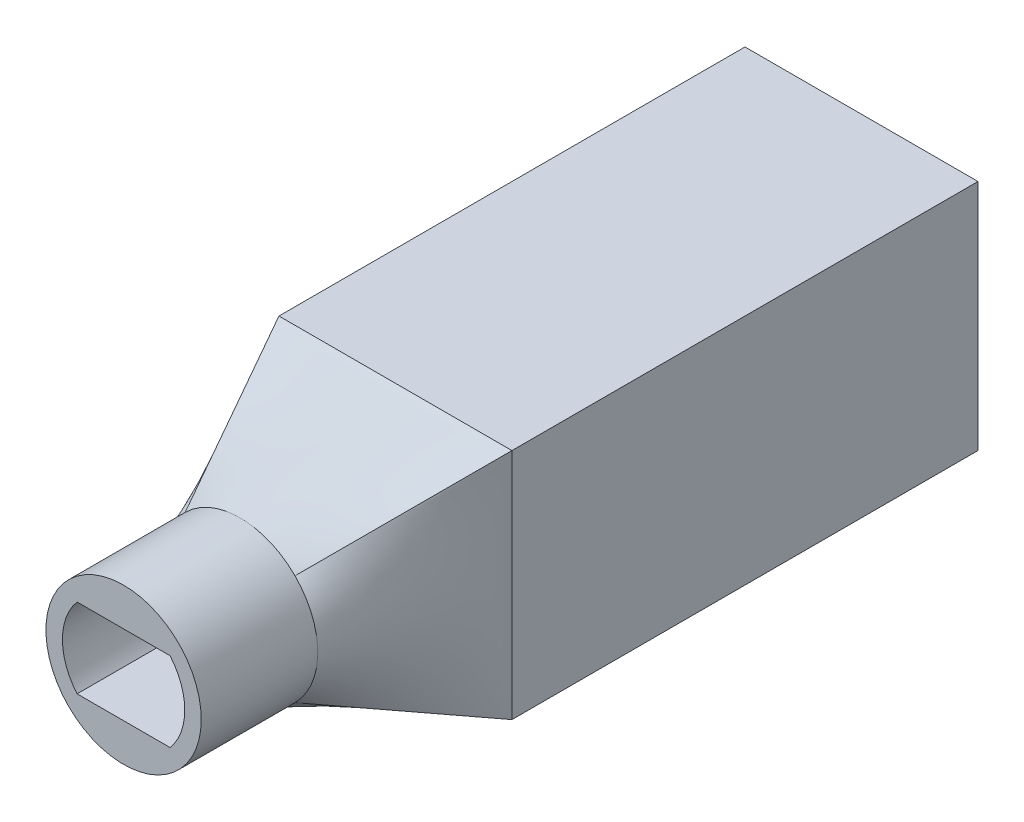
ISO-10303-21;
HEADER;
FILE_DESCRIPTION(('STEP AP214'),'2;1');
FILE_NAME('part.step','',(''),(''),'','','');
FILE_SCHEMA(('AUTOMOTIVE_DESIGN { 1 0 10303 214 1 1 1 1 }'));
ENDSEC;
DATA;
#1=APPLICATION_CONTEXT('core data for automotive mechanical design processes');
#2=APPLICATION_PROTOCOL_DEFINITION('international standard','automotive_design',2000,#1);
#3=PRODUCT_CONTEXT('',#1,'mechanical');
#4=PRODUCT('Part','Part','',(#3));
#5=PRODUCT_RELATED_PRODUCT_CATEGORY('part','',(#4));
#6=PRODUCT_DEFINITION_FORMATION('','',#4);
#7=PRODUCT_DEFINITION_CONTEXT('part definition',#1,'design');
#8=PRODUCT_DEFINITION('design','',#6,#7);
#9=PRODUCT_DEFINITION_SHAPE('','',#8);
#10=(LENGTH_UNIT() NAMED_UNIT(*) SI_UNIT(.MILLI.,.METRE.));
#11=(NAMED_UNIT(*) PLANE_ANGLE_UNIT() SI_UNIT($,.RADIAN.));
#12=(NAMED_UNIT(*) SI_UNIT($,.STERADIAN.) SOLID_ANGLE_UNIT());
#13=UNCERTAINTY_MEASURE_WITH_UNIT(LENGTH_MEASURE(1.E-05),#10,'distance_accuracy_value','');
#14=(GEOMETRIC_REPRESENTATION_CONTEXT(3) GLOBAL_UNCERTAINTY_ASSIGNED_CONTEXT((#13)) GLOBAL_UNIT_ASSIGNED_CONTEXT((#10,
#11,#12)) REPRESENTATION_CONTEXT('',''));
#15=CARTESIAN_POINT('',(0.,0.,0.));
#16=DIRECTION('',(0.,0.,1.));
#17=DIRECTION('',(1.,0.,0.));
#18=AXIS2_PLACEMENT_3D('',#15,#16,#17);
#19=CARTESIAN_POINT('',(0.,0.,38.1));
#20=DIRECTION('',(1.,0.,0.));
#21=DIRECTION('',(0.,0.,-1.));
#22=AXIS2_PLACEMENT_3D('',#19,#20,#21);
#23=PLANE('',#22);
#24=DIRECTION('',(0.,-1.,0.));
#25=VECTOR('',#24,1.);
#26=CARTESIAN_POINT('',(0.,0.,0.));
#27=LINE('',#26,#25);
#28=CARTESIAN_POINT('',(0.,19.05,0.));
#29=VERTEX_POINT('',#28);
#30=CARTESIAN_POINT('',(0.,0.,0.));
#31=VERTEX_POINT('',#30);
#32=EDGE_CURVE('E314',#29,#31,#27,.T.);
#33=ORIENTED_EDGE('',*,*,#32,.T.);
#34=DIRECTION('',(0.,0.,-1.));
#35=VECTOR('',#34,1.);
#36=CARTESIAN_POINT('',(0.,0.,38.1));
#37=LINE('',#36,#35);
#38=CARTESIAN_POINT('',(0.,0.,38.1));
#39=VERTEX_POINT('',#38);
#40=EDGE_CURVE('E12',#39,#31,#37,.T.);
#41=ORIENTED_EDGE('',*,*,#40,.F.);
#42=DIRECTION('',(0.,1.,0.));
#43=VECTOR('',#42,1.);
#44=CARTESIAN_POINT('',(0.,0.,38.1));
#45=LINE('',#44,#43);
#46=CARTESIAN_POINT('',(0.,19.05,38.1));
#47=VERTEX_POINT('',#46);
#48=EDGE_CURVE('E332',#47,#39,#45,.F.);
#49=ORIENTED_EDGE('',*,*,#48,.F.);
#50=DIRECTION('',(0.,0.,-1.));
#51=VECTOR('',#50,1.);
#52=CARTESIAN_POINT('',(0.,19.05,38.1));
#53=LINE('',#52,#51);
#54=EDGE_CURVE('E333',#47,#29,#53,.T.);
#55=ORIENTED_EDGE('',*,*,#54,.T.);
#56=EDGE_LOOP('',(#33,#41,#49,#55));
#57=FACE_BOUND('',#56,.T.);
#58=ADVANCED_FACE('F63',(#57),#23,.F.);
#59=CARTESIAN_POINT('',(0.,0.,38.1));
#60=DIRECTION('',(0.,1.,0.));
#61=DIRECTION('',(0.,0.,1.));
#62=AXIS2_PLACEMENT_3D('',#59,#60,#61);
#63=PLANE('',#62);
#64=DIRECTION('',(1.,0.,0.));
#65=VECTOR('',#64,1.);
#66=CARTESIAN_POINT('',(0.,0.,0.));
#67=LINE('',#66,#65);
#68=CARTESIAN_POINT('',(19.05,0.,0.));
#69=VERTEX_POINT('',#68);
#70=EDGE_CURVE('E320',#31,#69,#67,.T.);
#71=ORIENTED_EDGE('',*,*,#70,.T.);
#72=DIRECTION('',(0.,0.,-1.));
#73=VECTOR('',#72,1.);
#74=CARTESIAN_POINT('',(19.05,0.,38.1));
#75=LINE('',#74,#73);
#76=CARTESIAN_POINT('',(19.05,0.,38.1));
#77=VERTEX_POINT('',#76);
#78=EDGE_CURVE('E72',#77,#69,#75,.T.);
#79=ORIENTED_EDGE('',*,*,#78,.F.);
#80=DIRECTION('',(1.,0.,0.));
#81=VECTOR('',#80,1.);
#82=CARTESIAN_POINT('',(0.,0.,38.1));
#83=LINE('',#82,#81);
#84=EDGE_CURVE('E308',#39,#77,#83,.T.);
#85=ORIENTED_EDGE('',*,*,#84,.F.);
#86=ORIENTED_EDGE('',*,*,#40,.T.);
#87=EDGE_LOOP('',(#71,#79,#85,#86));
#88=FACE_BOUND('',#87,.T.);
#89=ADVANCED_FACE('F347',(#88),#63,.F.);
#90=CARTESIAN_POINT('',(19.05,0.,38.1));
#91=DIRECTION('',(-1.,0.,0.));
#92=DIRECTION('',(0.,0.,1.));
#93=AXIS2_PLACEMENT_3D('',#90,#91,#92);
#94=PLANE('',#93);
#95=DIRECTION('',(0.,1.,0.));
#96=VECTOR('',#95,1.);
#97=CARTESIAN_POINT('',(19.05,0.,0.));
#98=LINE('',#97,#96);
#99=CARTESIAN_POINT('',(19.05,19.05,0.));
#100=VERTEX_POINT('',#99);
#101=EDGE_CURVE('E325',#69,#100,#98,.T.);
#102=ORIENTED_EDGE('',*,*,#101,.T.);
#103=DIRECTION('',(0.,0.,-1.));
#104=VECTOR('',#103,1.);
#105=CARTESIAN_POINT('',(19.05,19.05,38.1));
#106=LINE('',#105,#104);
#107=CARTESIAN_POINT('',(19.05,19.05,38.1));
#108=VERTEX_POINT('',#107);
#109=EDGE_CURVE('E335',#108,#100,#106,.T.);
#110=ORIENTED_EDGE('',*,*,#109,.F.);
#111=DIRECTION('',(0.,1.,0.));
#112=VECTOR('',#111,1.);
#113=CARTESIAN_POINT('',(19.05,0.,38.1));
#114=LINE('',#113,#112);
#115=EDGE_CURVE('E343',#77,#108,#114,.T.);
#116=ORIENTED_EDGE('',*,*,#115,.F.);
#117=ORIENTED_EDGE('',*,*,#78,.T.);
#118=EDGE_LOOP('',(#102,#110,#116,#117));
#119=FACE_BOUND('',#118,.T.);
#120=ADVANCED_FACE('F358',(#119),#94,.F.);
#121=CARTESIAN_POINT('',(0.,19.05,38.1));
#122=DIRECTION('',(0.,-1.,0.));
#123=DIRECTION('',(0.,0.,-1.));
#124=AXIS2_PLACEMENT_3D('',#121,#122,#123);
#125=PLANE('',#124);
#126=DIRECTION('',(-1.,0.,0.));
#127=VECTOR('',#126,1.);
#128=CARTESIAN_POINT('',(0.,19.05,0.));
#129=LINE('',#128,#127);
#130=EDGE_CURVE('E328',#100,#29,#129,.T.);
#131=ORIENTED_EDGE('',*,*,#130,.T.);
#132=ORIENTED_EDGE('',*,*,#54,.F.);
#133=DIRECTION('',(1.,0.,0.));
#134=VECTOR('',#133,1.);
#135=CARTESIAN_POINT('',(0.,19.05,38.1));
#136=LINE('',#135,#134);
#137=EDGE_CURVE('E336',#108,#47,#136,.F.);
#138=ORIENTED_EDGE('',*,*,#137,.F.);
#139=ORIENTED_EDGE('',*,*,#109,.T.);
#140=EDGE_LOOP('',(#131,#132,#138,#139));
#141=FACE_BOUND('',#140,.T.);
#142=ADVANCED_FACE('F353',(#141),#125,.F.);
#143=CARTESIAN_POINT('',(0.,0.,0.));
#144=DIRECTION('',(0.,0.,-1.));
#145=DIRECTION('',(-1.,0.,0.));
#146=AXIS2_PLACEMENT_3D('',#143,#144,#145);
#147=PLANE('',#146);
#148=ORIENTED_EDGE('',*,*,#32,.F.);
#149=ORIENTED_EDGE('',*,*,#130,.F.);
#150=ORIENTED_EDGE('',*,*,#101,.F.);
#151=ORIENTED_EDGE('',*,*,#70,.F.);
#152=EDGE_LOOP('',(#148,#149,#150,#151));
#153=FACE_BOUND('',#152,.T.);
#154=ADVANCED_FACE('F212',(#153),#147,.T.);
#155=CARTESIAN_POINT('',(19.05,19.05,38.1));
#156=CARTESIAN_POINT('',(14.0151280605346,14.0151280605346,50.8));
#157=CARTESIAN_POINT('',(18.25625,19.05,38.1));
#158=CARTESIAN_POINT('',(13.7505447272012,14.2797113938679,50.8));
#159=CARTESIAN_POINT('',(17.4625,19.05,38.1));
#160=CARTESIAN_POINT('',(13.4525460627393,14.5306683581894,50.8));
#161=CARTESIAN_POINT('',(15.875,19.05,38.1));
#162=CARTESIAN_POINT('',(12.7937131756313,14.9837405106463,50.8));
#163=CARTESIAN_POINT('',(15.08125,19.05,38.1));
#164=CARTESIAN_POINT('',(12.4328453080246,15.1857090056158,50.8));
#165=CARTESIAN_POINT('',(13.49375,19.05,38.1));
#166=CARTESIAN_POINT('',(11.6613070052137,15.5196128449747,50.8));
#167=CARTESIAN_POINT('',(12.7,19.05,38.1));
#168=CARTESIAN_POINT('',(11.2506969744019,15.6513845272099,50.8));
#169=CARTESIAN_POINT('',(11.1125,19.05,38.1));
#170=CARTESIAN_POINT('',(10.4016533511812,15.8291332730645,50.8));
#171=CARTESIAN_POINT('',(10.31875,19.05,38.1));
#172=CARTESIAN_POINT('',(9.9633760201782,15.875,50.8));
#173=CARTESIAN_POINT('',(8.73124999999999,19.05,38.1));
#174=CARTESIAN_POINT('',(9.08662397982181,15.875,50.8));
#175=CARTESIAN_POINT('',(7.93749999999999,19.05,38.1));
#176=CARTESIAN_POINT('',(8.64834664881885,15.8291332730645,50.8));
#177=CARTESIAN_POINT('',(6.34999999999999,19.05,38.1));
#178=CARTESIAN_POINT('',(7.79930302559813,15.6513845272099,50.8));
#179=CARTESIAN_POINT('',(5.55624999999999,19.05,38.1));
#180=CARTESIAN_POINT('',(7.38869299478637,15.5196128449747,50.8));
#181=CARTESIAN_POINT('',(3.96874999999999,19.05,38.1));
#182=CARTESIAN_POINT('',(6.61715469197545,15.1857090056158,50.8));
#183=CARTESIAN_POINT('',(3.17499999999999,19.05,38.1));
#184=CARTESIAN_POINT('',(6.25628682436875,14.9837405106463,50.8));
#185=CARTESIAN_POINT('',(1.5875,19.05,38.1));
#186=CARTESIAN_POINT('',(5.59745393726075,14.5306683581894,50.8));
#187=CARTESIAN_POINT('',(0.793749999999998,19.05,38.1));
#188=CARTESIAN_POINT('',(5.29945527279876,14.2797113938679,50.8));
#189=CARTESIAN_POINT('',(0.,19.05,38.1));
#190=CARTESIAN_POINT('',(5.03487193946543,14.0151280605346,50.8));
#191=B_SPLINE_SURFACE_WITH_KNOTS('',3,1,((#155,#156),(#157,#158),(#159,#160),(#161,#162),(#163,
#164),(#165,#166),(#167,#168),(#169,#170),(#171,#172),(#173,#174),(#175,#176),(#177,#178),(#179,
#180),(#181,#182),(#183,#184),(#185,#186),(#187,#188),(#189,#190)),.UNSPECIFIED.,.F.,.F.,.F.,(4,
2,2,2,2,2,2,2,4),(2,2),(0.,0.125,0.25,0.375,0.5,0.625,0.75,0.875,1.),(0.,1.),.UNSPECIFIED.);
#192=DIRECTION('',(0.345804685672962,-0.345804685672962,0.872260419102717));
#193=VECTOR('',#192,1.);
#194=CARTESIAN_POINT('',(2.51743596973271,16.5325640302673,44.45));
#195=LINE('',#194,#193);
#196=CARTESIAN_POINT('',(5.03487193946543,14.0151280605346,50.8));
#197=VERTEX_POINT('',#196);
#198=EDGE_CURVE('E295',#47,#197,#195,.T.);
#199=CARTESIAN_POINT('',(9.525,9.525,50.8));
#200=DIRECTION('',(0.,0.,1.));
#201=DIRECTION('',(1.,0.,0.));
#202=AXIS2_PLACEMENT_3D('',#199,#200,#201);
#203=CIRCLE('',#202,6.35);
#204=CARTESIAN_POINT('',(14.0151280605346,14.0151280605346,50.8));
#205=VERTEX_POINT('',#204);
#206=EDGE_CURVE('E66',#205,#197,#203,.T.);
#207=DIRECTION('',(0.345804685672962,0.345804685672963,-0.872260419102717));
#208=VECTOR('',#207,1.);
#209=CARTESIAN_POINT('',(16.5325640302673,16.5325640302673,44.45));
#210=LINE('',#209,#208);
#211=EDGE_CURVE('E180',#205,#108,#210,.T.);
#212=ORIENTED_EDGE('',*,*,#137,.T.);
#213=ORIENTED_EDGE('',*,*,#198,.T.);
#214=ORIENTED_EDGE('',*,*,#206,.F.);
#215=ORIENTED_EDGE('',*,*,#211,.T.);
#216=EDGE_LOOP('',(#212,#213,#214,#215));
#217=FACE_BOUND('',#216,.T.);
#218=ADVANCED_FACE('F205',(#217),#191,.T.);
#219=CARTESIAN_POINT('',(0.,19.05,38.1));
#220=CARTESIAN_POINT('',(5.03487193946543,14.0151280605346,50.8));
#221=CARTESIAN_POINT('',(0.,18.25625,38.1));
#222=CARTESIAN_POINT('',(4.77028860613209,13.7505447272012,50.8));
#223=CARTESIAN_POINT('',(0.,17.4625,38.1));
#224=CARTESIAN_POINT('',(4.51933164181065,13.4525460627393,50.8));
#225=CARTESIAN_POINT('',(0.,15.875,38.1));
#226=CARTESIAN_POINT('',(4.06625948935367,12.7937131756313,50.8));
#227=CARTESIAN_POINT('',(0.,15.08125,38.1));
#228=CARTESIAN_POINT('',(3.86429099438416,12.4328453080246,50.8));
#229=CARTESIAN_POINT('',(0.,13.49375,38.1));
#230=CARTESIAN_POINT('',(3.53038715502529,11.6613070052136,50.8));
#231=CARTESIAN_POINT('',(0.,12.7,38.1));
#232=CARTESIAN_POINT('',(3.39861547279014,11.2506969744019,50.8));
#233=CARTESIAN_POINT('',(0.,11.1125,38.1));
#234=CARTESIAN_POINT('',(3.22086672693549,10.4016533511811,50.8));
#235=CARTESIAN_POINT('',(0.,10.31875,38.1));
#236=CARTESIAN_POINT('',(3.175,9.96337602017819,50.8));
#237=CARTESIAN_POINT('',(0.,8.73124999999999,38.1));
#238=CARTESIAN_POINT('',(3.175,9.08662397982181,50.8));
#239=CARTESIAN_POINT('',(0.,7.93749999999999,38.1));
#240=CARTESIAN_POINT('',(3.22086672693549,8.64834664881885,50.8));
#241=CARTESIAN_POINT('',(0.,6.34999999999999,38.1));
#242=CARTESIAN_POINT('',(3.39861547279014,7.79930302559812,50.8));
#243=CARTESIAN_POINT('',(0.,5.55624999999999,38.1));
#244=CARTESIAN_POINT('',(3.53038715502529,7.38869299478636,50.8));
#245=CARTESIAN_POINT('',(0.,3.96874999999999,38.1));
#246=CARTESIAN_POINT('',(3.86429099438416,6.61715469197544,50.8));
#247=CARTESIAN_POINT('',(0.,3.17499999999999,38.1));
#248=CARTESIAN_POINT('',(4.06625948935367,6.25628682436875,50.8));
#249=CARTESIAN_POINT('',(0.,1.5875,38.1));
#250=CARTESIAN_POINT('',(4.51933164181065,5.59745393726074,50.8));
#251=CARTESIAN_POINT('',(0.,0.793749999999998,38.1));
#252=CARTESIAN_POINT('',(4.77028860613209,5.29945527279875,50.8));
#253=CARTESIAN_POINT('',(0.,0.,38.1));
#254=CARTESIAN_POINT('',(5.03487193946543,5.03487193946542,50.8));
#255=B_SPLINE_SURFACE_WITH_KNOTS('',3,1,((#219,#220),(#221,#222),(#223,#224),(#225,#226),(#227,
#228),(#229,#230),(#231,#232),(#233,#234),(#235,#236),(#237,#238),(#239,#240),(#241,#242),(#243,
#244),(#245,#246),(#247,#248),(#249,#250),(#251,#252),(#253,#254)),.UNSPECIFIED.,.F.,.F.,.F.,(4,
2,2,2,2,2,2,2,4),(2,2),(0.,0.125,0.25,0.375,0.5,0.625,0.75,0.875,1.),(0.,1.),.UNSPECIFIED.);
#256=DIRECTION('',(0.345804685672962,0.345804685672962,0.872260419102717));
#257=VECTOR('',#256,1.);
#258=CARTESIAN_POINT('',(2.51743596973271,2.51743596973271,44.45));
#259=LINE('',#258,#257);
#260=CARTESIAN_POINT('',(5.03487193946543,5.03487193946542,50.8));
#261=VERTEX_POINT('',#260);
#262=EDGE_CURVE('E291',#39,#261,#259,.T.);
#263=EDGE_CURVE('E304',#197,#261,#203,.T.);
#264=ORIENTED_EDGE('',*,*,#48,.T.);
#265=ORIENTED_EDGE('',*,*,#262,.T.);
#266=ORIENTED_EDGE('',*,*,#263,.F.);
#267=ORIENTED_EDGE('',*,*,#198,.F.);
#268=EDGE_LOOP('',(#264,#265,#266,#267));
#269=FACE_BOUND('',#268,.T.);
#270=ADVANCED_FACE('F211',(#269),#255,.T.);
#271=CARTESIAN_POINT('',(19.05,0.,38.1));
#272=CARTESIAN_POINT('',(14.0151280605346,5.03487193946542,50.8));
#273=CARTESIAN_POINT('',(19.05,0.79375,38.1));
#274=CARTESIAN_POINT('',(14.2797113938679,5.29945527279875,50.8));
#275=CARTESIAN_POINT('',(19.05,1.5875,38.1));
#276=CARTESIAN_POINT('',(14.5306683581894,5.59745393726074,50.8));
#277=CARTESIAN_POINT('',(19.05,3.175,38.1));
#278=CARTESIAN_POINT('',(14.9837405106463,6.25628682436874,50.8));
#279=CARTESIAN_POINT('',(19.05,3.96875,38.1));
#280=CARTESIAN_POINT('',(15.1857090056158,6.61715469197544,50.8));
#281=CARTESIAN_POINT('',(19.05,5.55625,38.1));
#282=CARTESIAN_POINT('',(15.5196128449747,7.38869299478636,50.8));
#283=CARTESIAN_POINT('',(19.05,6.35,38.1));
#284=CARTESIAN_POINT('',(15.6513845272099,7.79930302559812,50.8));
#285=CARTESIAN_POINT('',(19.05,7.93749999999999,38.1));
#286=CARTESIAN_POINT('',(15.8291332730645,8.64834664881884,50.8));
#287=CARTESIAN_POINT('',(19.05,8.73124999999999,38.1));
#288=CARTESIAN_POINT('',(15.875,9.08662397982181,50.8));
#289=CARTESIAN_POINT('',(19.05,10.31875,38.1));
#290=CARTESIAN_POINT('',(15.875,9.96337602017819,50.8));
#291=CARTESIAN_POINT('',(19.05,11.1125,38.1));
#292=CARTESIAN_POINT('',(15.8291332730645,10.4016533511811,50.8));
#293=CARTESIAN_POINT('',(19.05,12.7,38.1));
#294=CARTESIAN_POINT('',(15.6513845272099,11.2506969744019,50.8));
#295=CARTESIAN_POINT('',(19.05,13.49375,38.1));
#296=CARTESIAN_POINT('',(15.5196128449747,11.6613070052136,50.8));
#297=CARTESIAN_POINT('',(19.05,15.08125,38.1));
#298=CARTESIAN_POINT('',(15.1857090056159,12.4328453080246,50.8));
#299=CARTESIAN_POINT('',(19.05,15.875,38.1));
#300=CARTESIAN_POINT('',(14.9837405106463,12.7937131756313,50.8));
#301=CARTESIAN_POINT('',(19.05,17.4625,38.1));
#302=CARTESIAN_POINT('',(14.5306683581894,13.4525460627393,50.8));
#303=CARTESIAN_POINT('',(19.05,18.25625,38.1));
#304=CARTESIAN_POINT('',(14.2797113938679,13.7505447272012,50.8));
#305=CARTESIAN_POINT('',(19.05,19.05,38.1));
#306=CARTESIAN_POINT('',(14.0151280605346,14.0151280605346,50.8));
#307=B_SPLINE_SURFACE_WITH_KNOTS('',3,1,((#271,#272),(#273,#274),(#275,#276),(#277,#278),(#279,
#280),(#281,#282),(#283,#284),(#285,#286),(#287,#288),(#289,#290),(#291,#292),(#293,#294),(#295,
#296),(#297,#298),(#299,#300),(#301,#302),(#303,#304),(#305,#306)),.UNSPECIFIED.,.F.,.F.,.F.,(4,
2,2,2,2,2,2,2,4),(2,2),(0.,0.125,0.25,0.375,0.5,0.625,0.75,0.875,1.),(0.,1.),.UNSPECIFIED.);
#308=CARTESIAN_POINT('',(14.0151280605346,5.03487193946542,50.8));
#309=VERTEX_POINT('',#308);
#310=EDGE_CURVE('E238',#309,#205,#203,.T.);
#311=DIRECTION('',(-0.345804685672962,0.345804685672962,0.872260419102717));
#312=VECTOR('',#311,1.);
#313=CARTESIAN_POINT('',(16.5325640302673,2.51743596973271,44.45));
#314=LINE('',#313,#312);
#315=EDGE_CURVE('E289',#77,#309,#314,.T.);
#316=ORIENTED_EDGE('',*,*,#115,.T.);
#317=ORIENTED_EDGE('',*,*,#211,.F.);
#318=ORIENTED_EDGE('',*,*,#310,.F.);
#319=ORIENTED_EDGE('',*,*,#315,.F.);
#320=EDGE_LOOP('',(#316,#317,#318,#319));
#321=FACE_BOUND('',#320,.T.);
#322=ADVANCED_FACE('F244',(#321),#307,.T.);
#323=CARTESIAN_POINT('',(0.,0.,38.1));
#324=CARTESIAN_POINT('',(5.03487193946543,5.03487193946542,50.8));
#325=CARTESIAN_POINT('',(0.79375,0.,38.1));
#326=CARTESIAN_POINT('',(5.29945527279876,4.77028860613209,50.8));
#327=CARTESIAN_POINT('',(1.5875,0.,38.1));
#328=CARTESIAN_POINT('',(5.59745393726074,4.51933164181064,50.8));
#329=CARTESIAN_POINT('',(3.175,0.,38.1));
#330=CARTESIAN_POINT('',(6.25628682436875,4.06625948935366,50.8));
#331=CARTESIAN_POINT('',(3.96875,0.,38.1));
#332=CARTESIAN_POINT('',(6.61715469197544,3.86429099438416,50.8));
#333=CARTESIAN_POINT('',(5.55625,0.,38.1));
#334=CARTESIAN_POINT('',(7.38869299478636,3.53038715502528,50.8));
#335=CARTESIAN_POINT('',(6.35,0.,38.1));
#336=CARTESIAN_POINT('',(7.79930302559812,3.39861547279014,50.8));
#337=CARTESIAN_POINT('',(7.9375,0.,38.1));
#338=CARTESIAN_POINT('',(8.64834664881885,3.22086672693549,50.8));
#339=CARTESIAN_POINT('',(8.73125,0.,38.1));
#340=CARTESIAN_POINT('',(9.08662397982181,3.175,50.8));
#341=CARTESIAN_POINT('',(10.31875,0.,38.1));
#342=CARTESIAN_POINT('',(9.96337602017819,3.175,50.8));
#343=CARTESIAN_POINT('',(11.1125,0.,38.1));
#344=CARTESIAN_POINT('',(10.4016533511812,3.22086672693549,50.8));
#345=CARTESIAN_POINT('',(12.7,0.,38.1));
#346=CARTESIAN_POINT('',(11.2506969744019,3.39861547279014,50.8));
#347=CARTESIAN_POINT('',(13.49375,0.,38.1));
#348=CARTESIAN_POINT('',(11.6613070052136,3.53038715502528,50.8));
#349=CARTESIAN_POINT('',(15.08125,0.,38.1));
#350=CARTESIAN_POINT('',(12.4328453080246,3.86429099438415,50.8));
#351=CARTESIAN_POINT('',(15.875,0.,38.1));
#352=CARTESIAN_POINT('',(12.7937131756313,4.06625948935366,50.8));
#353=CARTESIAN_POINT('',(17.4625,0.,38.1));
#354=CARTESIAN_POINT('',(13.4525460627393,4.51933164181064,50.8));
#355=CARTESIAN_POINT('',(18.25625,0.,38.1));
#356=CARTESIAN_POINT('',(13.7505447272012,4.77028860613209,50.8));
#357=CARTESIAN_POINT('',(19.05,0.,38.1));
#358=CARTESIAN_POINT('',(14.0151280605346,5.03487193946542,50.8));
#359=B_SPLINE_SURFACE_WITH_KNOTS('',3,1,((#323,#324),(#325,#326),(#327,#328),(#329,#330),(#331,
#332),(#333,#334),(#335,#336),(#337,#338),(#339,#340),(#341,#342),(#343,#344),(#345,#346),(#347,
#348),(#349,#350),(#351,#352),(#353,#354),(#355,#356),(#357,#358)),.UNSPECIFIED.,.F.,.F.,.F.,(4,
2,2,2,2,2,2,2,4),(2,2),(0.,0.125,0.25,0.375,0.5,0.625,0.75,0.875,1.),(0.,1.),.UNSPECIFIED.);
#360=EDGE_CURVE('E285',#261,#309,#203,.T.);
#361=ORIENTED_EDGE('',*,*,#84,.T.);
#362=ORIENTED_EDGE('',*,*,#315,.T.);
#363=ORIENTED_EDGE('',*,*,#360,.F.);
#364=ORIENTED_EDGE('',*,*,#262,.F.);
#365=EDGE_LOOP('',(#361,#362,#363,#364));
#366=FACE_BOUND('',#365,.T.);
#367=ADVANCED_FACE('F255',(#366),#359,.T.);
#368=CARTESIAN_POINT('',(9.525,9.525,60.325));
#369=DIRECTION('',(0.,0.,1.));
#370=DIRECTION('',(1.,0.,0.));
#371=AXIS2_PLACEMENT_3D('',#368,#369,#370);
#372=PLANE('',#371);
#373=CARTESIAN_POINT('',(9.525,9.525,60.325));
#374=DIRECTION('',(0.,0.,1.));
#375=DIRECTION('',(1.,0.,0.));
#376=AXIS2_PLACEMENT_3D('',#373,#374,#375);
#377=CIRCLE('',#376,6.35);
#378=CARTESIAN_POINT('',(15.875,9.525,60.325));
#379=VERTEX_POINT('',#378);
#380=EDGE_CURVE('E156',#379,#379,#377,.T.);
#381=ORIENTED_EDGE('',*,*,#380,.T.);
#382=EDGE_LOOP('',(#381));
#383=FACE_BOUND('',#382,.T.);
#384=DIRECTION('',(1.,0.,0.));
#385=VECTOR('',#384,1.);
#386=CARTESIAN_POINT('',(5.72532896160735,6.27499999999999,60.325));
#387=LINE('',#386,#385);
#388=CARTESIAN_POINT('',(5.72532896160735,6.27499999999999,60.325));
#389=VERTEX_POINT('',#388);
#390=CARTESIAN_POINT('',(13.3246710383927,6.27499999999999,60.325));
#391=VERTEX_POINT('',#390);
#392=EDGE_CURVE('E150',#389,#391,#387,.T.);
#393=ORIENTED_EDGE('',*,*,#392,.F.);
#394=CARTESIAN_POINT('',(9.525,9.525,60.325));
#395=DIRECTION('',(0.,0.,1.));
#396=DIRECTION('',(1.,0.,0.));
#397=AXIS2_PLACEMENT_3D('',#394,#395,#396);
#398=CIRCLE('',#397,5.);
#399=CARTESIAN_POINT('',(5.72532896160734,12.775,60.325));
#400=VERTEX_POINT('',#399);
#401=EDGE_CURVE('E141',#400,#389,#398,.T.);
#402=ORIENTED_EDGE('',*,*,#401,.F.);
#403=DIRECTION('',(-1.,0.,0.));
#404=VECTOR('',#403,1.);
#405=CARTESIAN_POINT('',(5.72532896160734,12.775,60.325));
#406=LINE('',#405,#404);
#407=CARTESIAN_POINT('',(13.3246710383927,12.775,60.325));
#408=VERTEX_POINT('',#407);
#409=EDGE_CURVE('E164',#408,#400,#406,.T.);
#410=ORIENTED_EDGE('',*,*,#409,.F.);
#411=CARTESIAN_POINT('',(9.525,9.525,60.325));
#412=DIRECTION('',(0.,0.,1.));
#413=DIRECTION('',(1.,0.,0.));
#414=AXIS2_PLACEMENT_3D('',#411,#412,#413);
#415=CIRCLE('',#414,5.);
#416=EDGE_CURVE('E162',#391,#408,#415,.T.);
#417=ORIENTED_EDGE('',*,*,#416,.F.);
#418=EDGE_LOOP('',(#393,#402,#410,#417));
#419=FACE_BOUND('',#418,.T.);
#420=ADVANCED_FACE('F160',(#383,#419),#372,.T.);
#421=CARTESIAN_POINT('',(9.525,9.525,60.325));
#422=DIRECTION('',(0.,0.,-1.));
#423=DIRECTION('',(-1.,0.,0.));
#424=AXIS2_PLACEMENT_3D('',#421,#422,#423);
#425=CYLINDRICAL_SURFACE('',#424,6.35);
#426=ORIENTED_EDGE('',*,*,#380,.F.);
#427=EDGE_LOOP('',(#426));
#428=FACE_BOUND('',#427,.T.);
#429=ORIENTED_EDGE('',*,*,#206,.T.);
#430=ORIENTED_EDGE('',*,*,#263,.T.);
#431=ORIENTED_EDGE('',*,*,#360,.T.);
#432=ORIENTED_EDGE('',*,*,#310,.T.);
#433=EDGE_LOOP('',(#429,#430,#431,#432));
#434=FACE_BOUND('',#433,.T.);
#435=ADVANCED_FACE('F193',(#428,#434),#425,.T.);
#436=CARTESIAN_POINT('',(9.525,9.525,60.325));
#437=DIRECTION('',(0.,0.,-1.));
#438=DIRECTION('',(-1.,0.,0.));
#439=AXIS2_PLACEMENT_3D('',#436,#437,#438);
#440=CYLINDRICAL_SURFACE('',#439,5.);
#441=CARTESIAN_POINT('',(9.525,9.525,50.8));
#442=DIRECTION('',(0.,0.,1.));
#443=DIRECTION('',(1.,0.,0.));
#444=AXIS2_PLACEMENT_3D('',#441,#442,#443);
#445=CIRCLE('',#444,5.);
#446=CARTESIAN_POINT('',(5.72532896160734,12.775,50.8));
#447=VERTEX_POINT('',#446);
#448=CARTESIAN_POINT('',(5.72532896160735,6.27499999999999,50.8));
#449=VERTEX_POINT('',#448);
#450=EDGE_CURVE('E80',#447,#449,#445,.T.);
#451=ORIENTED_EDGE('',*,*,#450,.F.);
#452=DIRECTION('',(0.,0.,-1.));
#453=VECTOR('',#452,1.);
#454=CARTESIAN_POINT('',(5.72532896160734,12.775,60.325));
#455=LINE('',#454,#453);
#456=EDGE_CURVE('E146',#400,#447,#455,.T.);
#457=ORIENTED_EDGE('',*,*,#456,.F.);
#458=ORIENTED_EDGE('',*,*,#401,.T.);
#459=DIRECTION('',(0.,0.,-1.));
#460=VECTOR('',#459,1.);
#461=CARTESIAN_POINT('',(5.72532896160735,6.27499999999999,60.325));
#462=LINE('',#461,#460);
#463=EDGE_CURVE('E144',#389,#449,#462,.T.);
#464=ORIENTED_EDGE('',*,*,#463,.T.);
#465=EDGE_LOOP('',(#451,#457,#458,#464));
#466=FACE_BOUND('',#465,.T.);
#467=ADVANCED_FACE('F143',(#466),#440,.F.);
#468=CARTESIAN_POINT('',(5.72532896160735,6.27499999999999,60.325));
#469=DIRECTION('',(0.,1.,0.));
#470=DIRECTION('',(0.,0.,1.));
#471=AXIS2_PLACEMENT_3D('',#468,#469,#470);
#472=PLANE('',#471);
#473=DIRECTION('',(1.,0.,0.));
#474=VECTOR('',#473,1.);
#475=CARTESIAN_POINT('',(5.72532896160735,6.27499999999999,50.8));
#476=LINE('',#475,#474);
#477=CARTESIAN_POINT('',(13.3246710383927,6.27499999999999,50.8));
#478=VERTEX_POINT('',#477);
#479=EDGE_CURVE('E84',#449,#478,#476,.T.);
#480=ORIENTED_EDGE('',*,*,#479,.F.);
#481=ORIENTED_EDGE('',*,*,#463,.F.);
#482=ORIENTED_EDGE('',*,*,#392,.T.);
#483=DIRECTION('',(0.,0.,-1.));
#484=VECTOR('',#483,1.);
#485=CARTESIAN_POINT('',(13.3246710383927,6.27499999999999,60.325));
#486=LINE('',#485,#484);
#487=EDGE_CURVE('E157',#391,#478,#486,.T.);
#488=ORIENTED_EDGE('',*,*,#487,.T.);
#489=EDGE_LOOP('',(#480,#481,#482,#488));
#490=FACE_BOUND('',#489,.T.);
#491=ADVANCED_FACE('F154',(#490),#472,.T.);
#492=CARTESIAN_POINT('',(9.525,9.525,60.325));
#493=DIRECTION('',(0.,0.,-1.));
#494=DIRECTION('',(-1.,0.,0.));
#495=AXIS2_PLACEMENT_3D('',#492,#493,#494);
#496=CYLINDRICAL_SURFACE('',#495,5.);
#497=CARTESIAN_POINT('',(9.525,9.525,50.8));
#498=DIRECTION('',(0.,0.,1.));
#499=DIRECTION('',(1.,0.,0.));
#500=AXIS2_PLACEMENT_3D('',#497,#498,#499);
#501=CIRCLE('',#500,5.);
#502=CARTESIAN_POINT('',(13.3246710383927,12.775,50.8));
#503=VERTEX_POINT('',#502);
#504=EDGE_CURVE('E170',#478,#503,#501,.T.);
#505=ORIENTED_EDGE('',*,*,#504,.F.);
#506=ORIENTED_EDGE('',*,*,#487,.F.);
#507=ORIENTED_EDGE('',*,*,#416,.T.);
#508=DIRECTION('',(0.,0.,-1.));
#509=VECTOR('',#508,1.);
#510=CARTESIAN_POINT('',(13.3246710383927,12.775,60.325));
#511=LINE('',#510,#509);
#512=EDGE_CURVE('E174',#408,#503,#511,.T.);
#513=ORIENTED_EDGE('',*,*,#512,.T.);
#514=EDGE_LOOP('',(#505,#506,#507,#513));
#515=FACE_BOUND('',#514,.T.);
#516=ADVANCED_FACE('F443',(#515),#496,.F.);
#517=CARTESIAN_POINT('',(5.72532896160734,12.775,60.325));
#518=DIRECTION('',(0.,-1.,0.));
#519=DIRECTION('',(0.,0.,-1.));
#520=AXIS2_PLACEMENT_3D('',#517,#518,#519);
#521=PLANE('',#520);
#522=DIRECTION('',(-1.,0.,0.));
#523=VECTOR('',#522,1.);
#524=CARTESIAN_POINT('',(5.72532896160734,12.775,50.8));
#525=LINE('',#524,#523);
#526=EDGE_CURVE('E151',#503,#447,#525,.T.);
#527=ORIENTED_EDGE('',*,*,#526,.F.);
#528=ORIENTED_EDGE('',*,*,#512,.F.);
#529=ORIENTED_EDGE('',*,*,#409,.T.);
#530=ORIENTED_EDGE('',*,*,#456,.T.);
#531=EDGE_LOOP('',(#527,#528,#529,#530));
#532=FACE_BOUND('',#531,.T.);
#533=ADVANCED_FACE('F452',(#532),#521,.T.);
#534=CARTESIAN_POINT('',(9.525,9.525,50.8));
#535=DIRECTION('',(0.,0.,1.));
#536=DIRECTION('',(1.,0.,0.));
#537=AXIS2_PLACEMENT_3D('',#534,#535,#536);
#538=PLANE('',#537);
#539=ORIENTED_EDGE('',*,*,#450,.T.);
#540=ORIENTED_EDGE('',*,*,#479,.T.);
#541=ORIENTED_EDGE('',*,*,#504,.T.);
#542=ORIENTED_EDGE('',*,*,#526,.T.);
#543=EDGE_LOOP('',(#539,#540,#541,#542));
#544=FACE_BOUND('',#543,.T.);
#545=ADVANCED_FACE('F267',(#544),#538,.T.);
#546=CLOSED_SHELL('',(#58,#89,#120,#142,#154,#218,#270,#322,#367,#420,#435,#467,#491,#516,#533,#545));
#547=MANIFOLD_SOLID_BREP('B2',#546);
#548=ADVANCED_BREP_SHAPE_REPRESENTATION('',(#18,#547),#14);
#549=SHAPE_DEFINITION_REPRESENTATION(#9,#548);
ENDSEC;
END-ISO-10303-21;
